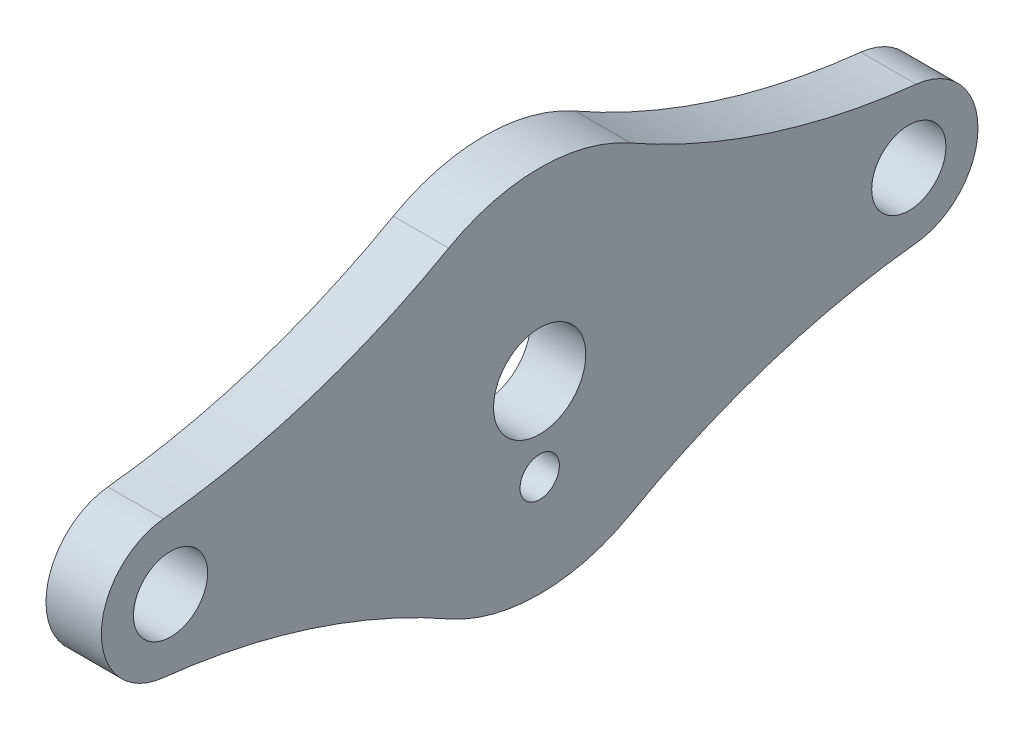
ISO-10303-21;
HEADER;
FILE_DESCRIPTION(('STEP AP214'),'2;1');
FILE_NAME('part.step','',(''),(''),'','','');
FILE_SCHEMA(('AUTOMOTIVE_DESIGN { 1 0 10303 214 1 1 1 1 }'));
ENDSEC;
DATA;
#1=APPLICATION_CONTEXT('core data for automotive mechanical design processes');
#2=APPLICATION_PROTOCOL_DEFINITION('international standard','automotive_design',2000,#1);
#3=PRODUCT_CONTEXT('',#1,'mechanical');
#4=PRODUCT('Part','Part','',(#3));
#5=PRODUCT_RELATED_PRODUCT_CATEGORY('part','',(#4));
#6=PRODUCT_DEFINITION_FORMATION('','',#4);
#7=PRODUCT_DEFINITION_CONTEXT('part definition',#1,'design');
#8=PRODUCT_DEFINITION('design','',#6,#7);
#9=PRODUCT_DEFINITION_SHAPE('','',#8);
#10=(LENGTH_UNIT() NAMED_UNIT(*) SI_UNIT(.MILLI.,.METRE.));
#11=(NAMED_UNIT(*) PLANE_ANGLE_UNIT() SI_UNIT($,.RADIAN.));
#12=(NAMED_UNIT(*) SI_UNIT($,.STERADIAN.) SOLID_ANGLE_UNIT());
#13=UNCERTAINTY_MEASURE_WITH_UNIT(LENGTH_MEASURE(1.E-05),#10,'distance_accuracy_value','');
#14=(GEOMETRIC_REPRESENTATION_CONTEXT(3) GLOBAL_UNCERTAINTY_ASSIGNED_CONTEXT((#13)) GLOBAL_UNIT_ASSIGNED_CONTEXT((#10,
#11,#12)) REPRESENTATION_CONTEXT('',''));
#15=CARTESIAN_POINT('',(0.,0.,0.));
#16=DIRECTION('',(0.,0.,1.));
#17=DIRECTION('',(1.,0.,0.));
#18=AXIS2_PLACEMENT_3D('',#15,#16,#17);
#19=CARTESIAN_POINT('',(-3.81,-55.2479855697507,31.303515625));
#20=DIRECTION('',(1.,0.,0.));
#21=DIRECTION('',(0.,0.,-1.));
#22=AXIS2_PLACEMENT_3D('',#19,#20,#21);
#23=CYLINDRICAL_SURFACE('',#22,50.8);
#24=CARTESIAN_POINT('',(0.,-55.2479855697507,31.303515625));
#25=DIRECTION('',(-1.,0.,0.));
#26=DIRECTION('',(0.,0.,1.));
#27=AXIS2_PLACEMENT_3D('',#24,#25,#26);
#28=CIRCLE('',#27,50.8);
#29=CARTESIAN_POINT('',(0.,-4.73554162026435,25.906015625));
#30=VERTEX_POINT('',#29);
#31=CARTESIAN_POINT('',(0.,-11.0495971139501,6.260703125));
#32=VERTEX_POINT('',#31);
#33=EDGE_CURVE('E156',#30,#32,#28,.T.);
#34=ORIENTED_EDGE('',*,*,#33,.F.);
#35=DIRECTION('',(1.,0.,0.));
#36=VECTOR('',#35,1.);
#37=CARTESIAN_POINT('',(-3.81,-4.73554162026435,25.906015625));
#38=LINE('',#37,#36);
#39=CARTESIAN_POINT('',(-3.81,-4.73554162026435,25.906015625));
#40=VERTEX_POINT('',#39);
#41=EDGE_CURVE('E11',#40,#30,#38,.T.);
#42=ORIENTED_EDGE('',*,*,#41,.F.);
#43=CARTESIAN_POINT('',(-3.81,-55.2479855697507,31.303515625));
#44=DIRECTION('',(-1.,0.,0.));
#45=DIRECTION('',(0.,0.,1.));
#46=AXIS2_PLACEMENT_3D('',#43,#44,#45);
#47=CIRCLE('',#46,50.8);
#48=CARTESIAN_POINT('',(-3.81,-11.0495971139501,6.260703125));
#49=VERTEX_POINT('',#48);
#50=EDGE_CURVE('E183',#40,#49,#47,.T.);
#51=ORIENTED_EDGE('',*,*,#50,.T.);
#52=DIRECTION('',(1.,0.,0.));
#53=VECTOR('',#52,1.);
#54=CARTESIAN_POINT('',(-3.81,-11.0495971139501,6.260703125));
#55=LINE('',#54,#53);
#56=EDGE_CURVE('E52',#49,#32,#55,.T.);
#57=ORIENTED_EDGE('',*,*,#56,.T.);
#58=EDGE_LOOP('',(#34,#42,#51,#57));
#59=FACE_BOUND('',#58,.T.);
#60=ADVANCED_FACE('F49',(#59),#23,.F.);
#61=CARTESIAN_POINT('',(-3.81,0.,25.4));
#62=DIRECTION('',(1.,0.,0.));
#63=DIRECTION('',(0.,0.,-1.));
#64=AXIS2_PLACEMENT_3D('',#61,#62,#63);
#65=CYLINDRICAL_SURFACE('',#64,4.7625);
#66=CARTESIAN_POINT('',(0.,0.,25.4));
#67=DIRECTION('',(1.,0.,0.));
#68=DIRECTION('',(0.,0.,-1.));
#69=AXIS2_PLACEMENT_3D('',#66,#67,#68);
#70=CIRCLE('',#69,4.7625);
#71=CARTESIAN_POINT('',(0.,4.73554162026435,25.906015625));
#72=VERTEX_POINT('',#71);
#73=EDGE_CURVE('E180',#72,#30,#70,.T.);
#74=ORIENTED_EDGE('',*,*,#73,.F.);
#75=DIRECTION('',(1.,0.,0.));
#76=VECTOR('',#75,1.);
#77=CARTESIAN_POINT('',(-3.81,4.73554162026435,25.906015625));
#78=LINE('',#77,#76);
#79=CARTESIAN_POINT('',(-3.81,4.73554162026435,25.906015625));
#80=VERTEX_POINT('',#79);
#81=EDGE_CURVE('E59',#80,#72,#78,.T.);
#82=ORIENTED_EDGE('',*,*,#81,.F.);
#83=CARTESIAN_POINT('',(-3.81,0.,25.4));
#84=DIRECTION('',(1.,0.,0.));
#85=DIRECTION('',(0.,0.,-1.));
#86=AXIS2_PLACEMENT_3D('',#83,#84,#85);
#87=CIRCLE('',#86,4.7625);
#88=EDGE_CURVE('E143',#80,#40,#87,.T.);
#89=ORIENTED_EDGE('',*,*,#88,.T.);
#90=ORIENTED_EDGE('',*,*,#41,.T.);
#91=EDGE_LOOP('',(#74,#82,#89,#90));
#92=FACE_BOUND('',#91,.T.);
#93=ADVANCED_FACE('F199',(#92),#65,.T.);
#94=CARTESIAN_POINT('',(-3.81,55.2479855697507,31.303515625));
#95=DIRECTION('',(1.,0.,0.));
#96=DIRECTION('',(0.,0.,-1.));
#97=AXIS2_PLACEMENT_3D('',#94,#95,#96);
#98=CYLINDRICAL_SURFACE('',#97,50.8);
#99=CARTESIAN_POINT('',(0.,55.2479855697507,31.303515625));
#100=DIRECTION('',(-1.,0.,0.));
#101=DIRECTION('',(0.,0.,-1.));
#102=AXIS2_PLACEMENT_3D('',#99,#100,#101);
#103=CIRCLE('',#102,50.8);
#104=CARTESIAN_POINT('',(0.,11.0495971139501,6.26070312500001));
#105=VERTEX_POINT('',#104);
#106=EDGE_CURVE('E130',#105,#72,#103,.T.);
#107=ORIENTED_EDGE('',*,*,#106,.F.);
#108=DIRECTION('',(1.,0.,0.));
#109=VECTOR('',#108,1.);
#110=CARTESIAN_POINT('',(-3.81,11.0495971139501,6.26070312500001));
#111=LINE('',#110,#109);
#112=CARTESIAN_POINT('',(-3.81,11.0495971139501,6.26070312500001));
#113=VERTEX_POINT('',#112);
#114=EDGE_CURVE('E125',#113,#105,#111,.T.);
#115=ORIENTED_EDGE('',*,*,#114,.F.);
#116=CARTESIAN_POINT('',(-3.81,55.2479855697507,31.303515625));
#117=DIRECTION('',(-1.,0.,0.));
#118=DIRECTION('',(0.,0.,-1.));
#119=AXIS2_PLACEMENT_3D('',#116,#117,#118);
#120=CIRCLE('',#119,50.8);
#121=EDGE_CURVE('E128',#113,#80,#120,.T.);
#122=ORIENTED_EDGE('',*,*,#121,.T.);
#123=ORIENTED_EDGE('',*,*,#81,.T.);
#124=EDGE_LOOP('',(#107,#115,#122,#123));
#125=FACE_BOUND('',#124,.T.);
#126=ADVANCED_FACE('F127',(#125),#98,.F.);
#127=CARTESIAN_POINT('',(-3.81,0.,0.));
#128=DIRECTION('',(1.,0.,0.));
#129=DIRECTION('',(0.,0.,-1.));
#130=AXIS2_PLACEMENT_3D('',#127,#128,#129);
#131=CYLINDRICAL_SURFACE('',#130,12.7);
#132=CARTESIAN_POINT('',(0.,0.,0.));
#133=DIRECTION('',(1.,0.,0.));
#134=DIRECTION('',(0.,0.,-1.));
#135=AXIS2_PLACEMENT_3D('',#132,#133,#134);
#136=CIRCLE('',#135,12.7);
#137=CARTESIAN_POINT('',(0.,11.0495971139501,-6.260703125));
#138=VERTEX_POINT('',#137);
#139=EDGE_CURVE('E176',#138,#105,#136,.T.);
#140=ORIENTED_EDGE('',*,*,#139,.F.);
#141=DIRECTION('',(1.,0.,0.));
#142=VECTOR('',#141,1.);
#143=CARTESIAN_POINT('',(-3.81,11.0495971139501,-6.260703125));
#144=LINE('',#143,#142);
#145=CARTESIAN_POINT('',(-3.81,11.0495971139501,-6.260703125));
#146=VERTEX_POINT('',#145);
#147=EDGE_CURVE('E135',#146,#138,#144,.T.);
#148=ORIENTED_EDGE('',*,*,#147,.F.);
#149=CARTESIAN_POINT('',(-3.81,0.,0.));
#150=DIRECTION('',(1.,0.,0.));
#151=DIRECTION('',(0.,0.,-1.));
#152=AXIS2_PLACEMENT_3D('',#149,#150,#151);
#153=CIRCLE('',#152,12.7);
#154=EDGE_CURVE('E141',#146,#113,#153,.T.);
#155=ORIENTED_EDGE('',*,*,#154,.T.);
#156=ORIENTED_EDGE('',*,*,#114,.T.);
#157=EDGE_LOOP('',(#140,#148,#155,#156));
#158=FACE_BOUND('',#157,.T.);
#159=ADVANCED_FACE('F146',(#158),#131,.T.);
#160=CARTESIAN_POINT('',(-3.81,55.2479855697507,-31.303515625));
#161=DIRECTION('',(1.,0.,0.));
#162=DIRECTION('',(0.,0.,-1.));
#163=AXIS2_PLACEMENT_3D('',#160,#161,#162);
#164=CYLINDRICAL_SURFACE('',#163,50.8);
#165=CARTESIAN_POINT('',(0.,55.2479855697507,-31.303515625));
#166=DIRECTION('',(-1.,0.,0.));
#167=DIRECTION('',(0.,0.,1.));
#168=AXIS2_PLACEMENT_3D('',#165,#166,#167);
#169=CIRCLE('',#168,50.8);
#170=CARTESIAN_POINT('',(0.,4.73554162026434,-25.906015625));
#171=VERTEX_POINT('',#170);
#172=EDGE_CURVE('E172',#171,#138,#169,.T.);
#173=ORIENTED_EDGE('',*,*,#172,.F.);
#174=DIRECTION('',(1.,0.,0.));
#175=VECTOR('',#174,1.);
#176=CARTESIAN_POINT('',(-3.81,4.73554162026434,-25.906015625));
#177=LINE('',#176,#175);
#178=CARTESIAN_POINT('',(-3.81,4.73554162026434,-25.906015625));
#179=VERTEX_POINT('',#178);
#180=EDGE_CURVE('E188',#179,#171,#177,.T.);
#181=ORIENTED_EDGE('',*,*,#180,.F.);
#182=CARTESIAN_POINT('',(-3.81,55.2479855697507,-31.303515625));
#183=DIRECTION('',(-1.,0.,0.));
#184=DIRECTION('',(0.,0.,1.));
#185=AXIS2_PLACEMENT_3D('',#182,#183,#184);
#186=CIRCLE('',#185,50.8);
#187=EDGE_CURVE('E147',#179,#146,#186,.T.);
#188=ORIENTED_EDGE('',*,*,#187,.T.);
#189=ORIENTED_EDGE('',*,*,#147,.T.);
#190=EDGE_LOOP('',(#173,#181,#188,#189));
#191=FACE_BOUND('',#190,.T.);
#192=ADVANCED_FACE('F212',(#191),#164,.F.);
#193=CARTESIAN_POINT('',(-3.81,0.,-25.4));
#194=DIRECTION('',(1.,0.,0.));
#195=DIRECTION('',(0.,0.,-1.));
#196=AXIS2_PLACEMENT_3D('',#193,#194,#195);
#197=CYLINDRICAL_SURFACE('',#196,4.7625);
#198=CARTESIAN_POINT('',(0.,0.,-25.4));
#199=DIRECTION('',(1.,0.,0.));
#200=DIRECTION('',(0.,0.,1.));
#201=AXIS2_PLACEMENT_3D('',#198,#199,#200);
#202=CIRCLE('',#201,4.7625);
#203=CARTESIAN_POINT('',(0.,-4.73554162026435,-25.906015625));
#204=VERTEX_POINT('',#203);
#205=EDGE_CURVE('E168',#204,#171,#202,.T.);
#206=ORIENTED_EDGE('',*,*,#205,.F.);
#207=DIRECTION('',(1.,0.,0.));
#208=VECTOR('',#207,1.);
#209=CARTESIAN_POINT('',(-3.81,-4.73554162026435,-25.906015625));
#210=LINE('',#209,#208);
#211=CARTESIAN_POINT('',(-3.81,-4.73554162026435,-25.906015625));
#212=VERTEX_POINT('',#211);
#213=EDGE_CURVE('E191',#212,#204,#210,.T.);
#214=ORIENTED_EDGE('',*,*,#213,.F.);
#215=CARTESIAN_POINT('',(-3.81,0.,-25.4));
#216=DIRECTION('',(1.,0.,0.));
#217=DIRECTION('',(0.,0.,1.));
#218=AXIS2_PLACEMENT_3D('',#215,#216,#217);
#219=CIRCLE('',#218,4.7625);
#220=EDGE_CURVE('E150',#212,#179,#219,.T.);
#221=ORIENTED_EDGE('',*,*,#220,.T.);
#222=ORIENTED_EDGE('',*,*,#180,.T.);
#223=EDGE_LOOP('',(#206,#214,#221,#222));
#224=FACE_BOUND('',#223,.T.);
#225=ADVANCED_FACE('F215',(#224),#197,.T.);
#226=CARTESIAN_POINT('',(-3.81,-55.2479855697507,-31.303515625));
#227=DIRECTION('',(1.,0.,0.));
#228=DIRECTION('',(0.,0.,-1.));
#229=AXIS2_PLACEMENT_3D('',#226,#227,#228);
#230=CYLINDRICAL_SURFACE('',#229,50.8);
#231=CARTESIAN_POINT('',(0.,-55.2479855697507,-31.303515625));
#232=DIRECTION('',(-1.,0.,0.));
#233=DIRECTION('',(0.,0.,-1.));
#234=AXIS2_PLACEMENT_3D('',#231,#232,#233);
#235=CIRCLE('',#234,50.8);
#236=CARTESIAN_POINT('',(0.,-11.0495971139501,-6.26070312500001));
#237=VERTEX_POINT('',#236);
#238=EDGE_CURVE('E164',#237,#204,#235,.T.);
#239=ORIENTED_EDGE('',*,*,#238,.F.);
#240=DIRECTION('',(1.,0.,0.));
#241=VECTOR('',#240,1.);
#242=CARTESIAN_POINT('',(-3.81,-11.0495971139501,-6.26070312500001));
#243=LINE('',#242,#241);
#244=CARTESIAN_POINT('',(-3.81,-11.0495971139501,-6.26070312500001));
#245=VERTEX_POINT('',#244);
#246=EDGE_CURVE('E192',#245,#237,#243,.T.);
#247=ORIENTED_EDGE('',*,*,#246,.F.);
#248=CARTESIAN_POINT('',(-3.81,-55.2479855697507,-31.303515625));
#249=DIRECTION('',(-1.,0.,0.));
#250=DIRECTION('',(0.,0.,-1.));
#251=AXIS2_PLACEMENT_3D('',#248,#249,#250);
#252=CIRCLE('',#251,50.8);
#253=EDGE_CURVE('E289',#245,#212,#252,.T.);
#254=ORIENTED_EDGE('',*,*,#253,.T.);
#255=ORIENTED_EDGE('',*,*,#213,.T.);
#256=EDGE_LOOP('',(#239,#247,#254,#255));
#257=FACE_BOUND('',#256,.T.);
#258=ADVANCED_FACE('F219',(#257),#230,.F.);
#259=CARTESIAN_POINT('',(-3.81,0.,0.));
#260=DIRECTION('',(1.,0.,0.));
#261=DIRECTION('',(0.,0.,-1.));
#262=AXIS2_PLACEMENT_3D('',#259,#260,#261);
#263=CYLINDRICAL_SURFACE('',#262,12.7);
#264=CARTESIAN_POINT('',(0.,0.,0.));
#265=DIRECTION('',(1.,0.,0.));
#266=DIRECTION('',(0.,0.,-1.));
#267=AXIS2_PLACEMENT_3D('',#264,#265,#266);
#268=CIRCLE('',#267,12.7);
#269=EDGE_CURVE('E160',#32,#237,#268,.T.);
#270=ORIENTED_EDGE('',*,*,#269,.F.);
#271=ORIENTED_EDGE('',*,*,#56,.F.);
#272=CARTESIAN_POINT('',(-3.81,0.,0.));
#273=DIRECTION('',(1.,0.,0.));
#274=DIRECTION('',(0.,0.,-1.));
#275=AXIS2_PLACEMENT_3D('',#272,#273,#274);
#276=CIRCLE('',#275,12.7);
#277=EDGE_CURVE('E287',#49,#245,#276,.T.);
#278=ORIENTED_EDGE('',*,*,#277,.T.);
#279=ORIENTED_EDGE('',*,*,#246,.T.);
#280=EDGE_LOOP('',(#270,#271,#278,#279));
#281=FACE_BOUND('',#280,.T.);
#282=ADVANCED_FACE('F196',(#281),#263,.T.);
#283=CARTESIAN_POINT('',(-3.81,-27.6239927848753,15.6517578125));
#284=DIRECTION('',(-1.,0.,0.));
#285=DIRECTION('',(0.,0.,1.));
#286=AXIS2_PLACEMENT_3D('',#283,#284,#285);
#287=PLANE('',#286);
#288=CARTESIAN_POINT('',(-3.81,0.,0.));
#289=DIRECTION('',(-1.,0.,0.));
#290=DIRECTION('',(0.,0.,1.));
#291=AXIS2_PLACEMENT_3D('',#288,#289,#290);
#292=CIRCLE('',#291,3.175);
#293=CARTESIAN_POINT('',(-3.81,0.,3.175));
#294=VERTEX_POINT('',#293);
#295=EDGE_CURVE('E257',#294,#294,#292,.T.);
#296=ORIENTED_EDGE('',*,*,#295,.F.);
#297=EDGE_LOOP('',(#296));
#298=FACE_BOUND('',#297,.T.);
#299=CARTESIAN_POINT('',(-3.81,-5.715,0.));
#300=DIRECTION('',(-1.,0.,0.));
#301=DIRECTION('',(0.,0.,1.));
#302=AXIS2_PLACEMENT_3D('',#299,#300,#301);
#303=CIRCLE('',#302,1.35255);
#304=CARTESIAN_POINT('',(-3.81,-5.715,1.35255));
#305=VERTEX_POINT('',#304);
#306=EDGE_CURVE('E261',#305,#305,#303,.T.);
#307=ORIENTED_EDGE('',*,*,#306,.F.);
#308=EDGE_LOOP('',(#307));
#309=FACE_BOUND('',#308,.T.);
#310=CARTESIAN_POINT('',(-3.81,0.,-25.4));
#311=DIRECTION('',(-1.,0.,0.));
#312=DIRECTION('',(0.,0.,1.));
#313=AXIS2_PLACEMENT_3D('',#310,#311,#312);
#314=CIRCLE('',#313,2.55269999999999);
#315=CARTESIAN_POINT('',(-3.81,0.,-22.8473));
#316=VERTEX_POINT('',#315);
#317=EDGE_CURVE('E270',#316,#316,#314,.T.);
#318=ORIENTED_EDGE('',*,*,#317,.F.);
#319=EDGE_LOOP('',(#318));
#320=FACE_BOUND('',#319,.T.);
#321=CARTESIAN_POINT('',(-3.81,0.,25.4));
#322=DIRECTION('',(-1.,0.,0.));
#323=DIRECTION('',(0.,0.,1.));
#324=AXIS2_PLACEMENT_3D('',#321,#322,#323);
#325=CIRCLE('',#324,2.55269999999999);
#326=CARTESIAN_POINT('',(-3.81,0.,27.9527));
#327=VERTEX_POINT('',#326);
#328=EDGE_CURVE('E278',#327,#327,#325,.T.);
#329=ORIENTED_EDGE('',*,*,#328,.F.);
#330=EDGE_LOOP('',(#329));
#331=FACE_BOUND('',#330,.T.);
#332=ORIENTED_EDGE('',*,*,#50,.F.);
#333=ORIENTED_EDGE('',*,*,#88,.F.);
#334=ORIENTED_EDGE('',*,*,#121,.F.);
#335=ORIENTED_EDGE('',*,*,#154,.F.);
#336=ORIENTED_EDGE('',*,*,#187,.F.);
#337=ORIENTED_EDGE('',*,*,#220,.F.);
#338=ORIENTED_EDGE('',*,*,#253,.F.);
#339=ORIENTED_EDGE('',*,*,#277,.F.);
#340=EDGE_LOOP('',(#332,#333,#334,#335,#336,#337,#338,#339));
#341=FACE_BOUND('',#340,.T.);
#342=ADVANCED_FACE('F139',(#298,#309,#320,#331,#341),#287,.T.);
#343=CARTESIAN_POINT('',(0.,-27.6239927848753,15.6517578125));
#344=DIRECTION('',(-1.,0.,0.));
#345=DIRECTION('',(0.,0.,1.));
#346=AXIS2_PLACEMENT_3D('',#343,#344,#345);
#347=PLANE('',#346);
#348=CARTESIAN_POINT('',(0.,0.,0.));
#349=DIRECTION('',(-1.,0.,0.));
#350=DIRECTION('',(0.,0.,1.));
#351=AXIS2_PLACEMENT_3D('',#348,#349,#350);
#352=CIRCLE('',#351,3.175);
#353=CARTESIAN_POINT('',(0.,0.,3.175));
#354=VERTEX_POINT('',#353);
#355=EDGE_CURVE('E255',#354,#354,#352,.T.);
#356=ORIENTED_EDGE('',*,*,#355,.T.);
#357=EDGE_LOOP('',(#356));
#358=FACE_BOUND('',#357,.T.);
#359=CARTESIAN_POINT('',(0.,-5.715,0.));
#360=DIRECTION('',(-1.,0.,0.));
#361=DIRECTION('',(0.,0.,1.));
#362=AXIS2_PLACEMENT_3D('',#359,#360,#361);
#363=CIRCLE('',#362,1.35255);
#364=CARTESIAN_POINT('',(0.,-5.715,1.35255));
#365=VERTEX_POINT('',#364);
#366=EDGE_CURVE('E267',#365,#365,#363,.T.);
#367=ORIENTED_EDGE('',*,*,#366,.T.);
#368=EDGE_LOOP('',(#367));
#369=FACE_BOUND('',#368,.T.);
#370=CARTESIAN_POINT('',(0.,0.,-25.4));
#371=DIRECTION('',(-1.,0.,0.));
#372=DIRECTION('',(0.,0.,1.));
#373=AXIS2_PLACEMENT_3D('',#370,#371,#372);
#374=CIRCLE('',#373,2.5527);
#375=CARTESIAN_POINT('',(0.,0.,-22.8473));
#376=VERTEX_POINT('',#375);
#377=EDGE_CURVE('E274',#376,#376,#374,.T.);
#378=ORIENTED_EDGE('',*,*,#377,.T.);
#379=EDGE_LOOP('',(#378));
#380=FACE_BOUND('',#379,.T.);
#381=CARTESIAN_POINT('',(0.,0.,25.4));
#382=DIRECTION('',(-1.,0.,0.));
#383=DIRECTION('',(0.,0.,1.));
#384=AXIS2_PLACEMENT_3D('',#381,#382,#383);
#385=CIRCLE('',#384,2.5527);
#386=CARTESIAN_POINT('',(0.,0.,27.9527));
#387=VERTEX_POINT('',#386);
#388=EDGE_CURVE('E161',#387,#387,#385,.T.);
#389=ORIENTED_EDGE('',*,*,#388,.T.);
#390=EDGE_LOOP('',(#389));
#391=FACE_BOUND('',#390,.T.);
#392=ORIENTED_EDGE('',*,*,#33,.T.);
#393=ORIENTED_EDGE('',*,*,#269,.T.);
#394=ORIENTED_EDGE('',*,*,#238,.T.);
#395=ORIENTED_EDGE('',*,*,#205,.T.);
#396=ORIENTED_EDGE('',*,*,#172,.T.);
#397=ORIENTED_EDGE('',*,*,#139,.T.);
#398=ORIENTED_EDGE('',*,*,#106,.T.);
#399=ORIENTED_EDGE('',*,*,#73,.T.);
#400=EDGE_LOOP('',(#392,#393,#394,#395,#396,#397,#398,#399));
#401=FACE_BOUND('',#400,.T.);
#402=ADVANCED_FACE('F198',(#358,#369,#380,#391,#401),#347,.F.);
#403=CARTESIAN_POINT('',(-3.81,0.,25.4));
#404=DIRECTION('',(-1.,0.,0.));
#405=DIRECTION('',(0.,0.,1.));
#406=AXIS2_PLACEMENT_3D('',#403,#404,#405);
#407=CYLINDRICAL_SURFACE('',#406,2.55269999999999);
#408=ORIENTED_EDGE('',*,*,#388,.F.);
#409=EDGE_LOOP('',(#408));
#410=FACE_BOUND('',#409,.T.);
#411=ORIENTED_EDGE('',*,*,#328,.T.);
#412=EDGE_LOOP('',(#411));
#413=FACE_BOUND('',#412,.T.);
#414=ADVANCED_FACE('F231',(#410,#413),#407,.F.);
#415=CARTESIAN_POINT('',(-3.81,0.,-25.4));
#416=DIRECTION('',(-1.,0.,0.));
#417=DIRECTION('',(0.,0.,1.));
#418=AXIS2_PLACEMENT_3D('',#415,#416,#417);
#419=CYLINDRICAL_SURFACE('',#418,2.55269999999999);
#420=ORIENTED_EDGE('',*,*,#377,.F.);
#421=EDGE_LOOP('',(#420));
#422=FACE_BOUND('',#421,.T.);
#423=ORIENTED_EDGE('',*,*,#317,.T.);
#424=EDGE_LOOP('',(#423));
#425=FACE_BOUND('',#424,.T.);
#426=ADVANCED_FACE('F238',(#422,#425),#419,.F.);
#427=CARTESIAN_POINT('',(-3.81,-5.715,0.));
#428=DIRECTION('',(-1.,0.,0.));
#429=DIRECTION('',(0.,0.,1.));
#430=AXIS2_PLACEMENT_3D('',#427,#428,#429);
#431=CYLINDRICAL_SURFACE('',#430,1.35255);
#432=ORIENTED_EDGE('',*,*,#366,.F.);
#433=EDGE_LOOP('',(#432));
#434=FACE_BOUND('',#433,.T.);
#435=ORIENTED_EDGE('',*,*,#306,.T.);
#436=EDGE_LOOP('',(#435));
#437=FACE_BOUND('',#436,.T.);
#438=ADVANCED_FACE('F242',(#434,#437),#431,.F.);
#439=CARTESIAN_POINT('',(0.,0.,0.));
#440=DIRECTION('',(-1.,0.,0.));
#441=DIRECTION('',(0.,0.,1.));
#442=AXIS2_PLACEMENT_3D('',#439,#440,#441);
#443=CYLINDRICAL_SURFACE('',#442,3.175);
#444=CARTESIAN_POINT('',(0.,0.,3.175));
#445=CARTESIAN_POINT('',(-0.0396874999999999,0.,3.175));
#446=CARTESIAN_POINT('',(-0.079375,0.,3.175));
#447=CARTESIAN_POINT('',(-0.15875,0.,3.175));
#448=CARTESIAN_POINT('',(-0.1984375,0.,3.175));
#449=CARTESIAN_POINT('',(-0.2778125,0.,3.175));
#450=CARTESIAN_POINT('',(-0.3175,0.,3.175));
#451=CARTESIAN_POINT('',(-0.396875,0.,3.175));
#452=CARTESIAN_POINT('',(-0.4365625,0.,3.175));
#453=CARTESIAN_POINT('',(-0.5159375,0.,3.175));
#454=CARTESIAN_POINT('',(-0.555625,0.,3.175));
#455=CARTESIAN_POINT('',(-0.635,0.,3.175));
#456=CARTESIAN_POINT('',(-0.6746875,0.,3.175));
#457=CARTESIAN_POINT('',(-0.7540625,0.,3.175));
#458=CARTESIAN_POINT('',(-0.79375,0.,3.175));
#459=CARTESIAN_POINT('',(-0.873125,0.,3.175));
#460=CARTESIAN_POINT('',(-0.9128125,0.,3.175));
#461=CARTESIAN_POINT('',(-0.9921875,0.,3.175));
#462=CARTESIAN_POINT('',(-1.031875,0.,3.175));
#463=CARTESIAN_POINT('',(-1.11125,0.,3.175));
#464=CARTESIAN_POINT('',(-1.1509375,0.,3.175));
#465=CARTESIAN_POINT('',(-1.2303125,0.,3.175));
#466=CARTESIAN_POINT('',(-1.27,0.,3.175));
#467=CARTESIAN_POINT('',(-1.349375,0.,3.175));
#468=CARTESIAN_POINT('',(-1.3890625,0.,3.175));
#469=CARTESIAN_POINT('',(-1.4684375,0.,3.175));
#470=CARTESIAN_POINT('',(-1.508125,0.,3.175));
#471=CARTESIAN_POINT('',(-1.5875,0.,3.175));
#472=CARTESIAN_POINT('',(-1.6271875,0.,3.175));
#473=CARTESIAN_POINT('',(-1.7065625,0.,3.175));
#474=CARTESIAN_POINT('',(-1.74625,0.,3.175));
#475=CARTESIAN_POINT('',(-1.825625,0.,3.175));
#476=CARTESIAN_POINT('',(-1.8653125,0.,3.175));
#477=CARTESIAN_POINT('',(-1.9446875,0.,3.175));
#478=CARTESIAN_POINT('',(-1.984375,0.,3.175));
#479=CARTESIAN_POINT('',(-2.06375,0.,3.175));
#480=CARTESIAN_POINT('',(-2.1034375,0.,3.175));
#481=CARTESIAN_POINT('',(-2.1828125,0.,3.175));
#482=CARTESIAN_POINT('',(-2.2225,0.,3.175));
#483=CARTESIAN_POINT('',(-2.301875,0.,3.175));
#484=CARTESIAN_POINT('',(-2.3415625,0.,3.175));
#485=CARTESIAN_POINT('',(-2.4209375,0.,3.175));
#486=CARTESIAN_POINT('',(-2.460625,0.,3.175));
#487=CARTESIAN_POINT('',(-2.54,0.,3.175));
#488=CARTESIAN_POINT('',(-2.5796875,0.,3.175));
#489=CARTESIAN_POINT('',(-2.6590625,0.,3.175));
#490=CARTESIAN_POINT('',(-2.69875,0.,3.175));
#491=CARTESIAN_POINT('',(-2.778125,0.,3.175));
#492=CARTESIAN_POINT('',(-2.8178125,0.,3.175));
#493=CARTESIAN_POINT('',(-2.8971875,0.,3.175));
#494=CARTESIAN_POINT('',(-2.936875,0.,3.175));
#495=CARTESIAN_POINT('',(-3.01625,0.,3.175));
#496=CARTESIAN_POINT('',(-3.0559375,0.,3.175));
#497=CARTESIAN_POINT('',(-3.1353125,0.,3.175));
#498=CARTESIAN_POINT('',(-3.175,0.,3.175));
#499=CARTESIAN_POINT('',(-3.254375,0.,3.175));
#500=CARTESIAN_POINT('',(-3.2940625,0.,3.175));
#501=CARTESIAN_POINT('',(-3.3734375,0.,3.175));
#502=CARTESIAN_POINT('',(-3.413125,0.,3.175));
#503=CARTESIAN_POINT('',(-3.4925,0.,3.175));
#504=CARTESIAN_POINT('',(-3.5321875,0.,3.175));
#505=CARTESIAN_POINT('',(-3.6115625,0.,3.175));
#506=CARTESIAN_POINT('',(-3.65125,0.,3.175));
#507=CARTESIAN_POINT('',(-3.730625,0.,3.175));
#508=CARTESIAN_POINT('',(-3.7703125,0.,3.175));
#509=CARTESIAN_POINT('',(-3.81,0.,3.175));
#510=B_SPLINE_CURVE_WITH_KNOTS('',3,(#444,#445,#446,#447,#448,#449,#450,#451,#452,#453,#454,
#455,#456,#457,#458,#459,#460,#461,#462,#463,#464,#465,#466,#467,#468,#469,#470,#471,#472,#473,
#474,#475,#476,#477,#478,#479,#480,#481,#482,#483,#484,#485,#486,#487,#488,#489,#490,#491,#492,
#493,#494,#495,#496,#497,#498,#499,#500,#501,#502,#503,#504,#505,#506,#507,#508,#509),
.UNSPECIFIED.,.F.,.F.,(4,2,2,2,2,2,2,2,2,2,2,2,2,2,2,2,2,2,2,2,2,2,2,2,2,2,2,2,2,2,2,2,4),(0.,
0.1190625,0.238125,0.3571875,0.47625,0.5953125,0.714375,0.8334375,0.9525,1.0715625,1.190625,
1.3096875,1.42875,1.5478125,1.666875,1.7859375,1.905,2.0240625,2.143125,2.2621875,2.38125,
2.5003125,2.619375,2.7384375,2.8575,2.9765625,3.095625,3.2146875,3.33375,3.4528125,3.571875,
3.6909375,3.81),.UNSPECIFIED.);
#511=EDGE_CURVE('BSEAM246',#354,#294,#510,.T.);
#512=ORIENTED_EDGE('',*,*,#355,.F.);
#513=ORIENTED_EDGE('',*,*,#295,.T.);
#514=ORIENTED_EDGE('',*,*,#511,.T.);
#515=ORIENTED_EDGE('',*,*,#511,.F.);
#516=EDGE_LOOP('',(#512,#514,#513,#515));
#517=FACE_BOUND('',#516,.T.);
#518=ADVANCED_FACE('F246',(#517),#443,.F.);
#519=CLOSED_SHELL('',(#60,#93,#126,#159,#192,#225,#258,#282,#342,#402,#414,#426,#438,#518));
#520=MANIFOLD_SOLID_BREP('B2',#519);
#521=ADVANCED_BREP_SHAPE_REPRESENTATION('',(#18,#520),#14);
#522=SHAPE_DEFINITION_REPRESENTATION(#9,#521);
ENDSEC;
END-ISO-10303-21;
